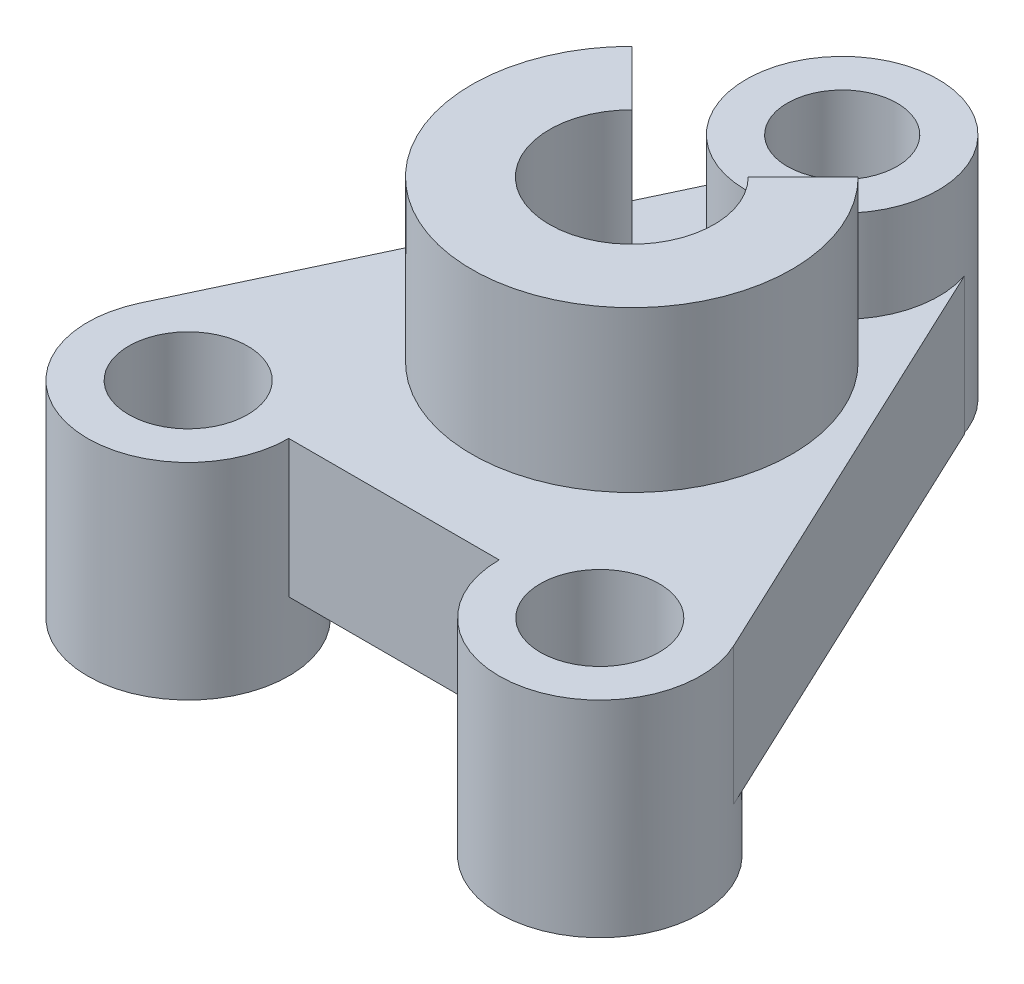
ISO-10303-21;
HEADER;
FILE_DESCRIPTION(('STEP AP214'),'2;1');
FILE_NAME('part.step','',(''),(''),'','','');
FILE_SCHEMA(('AUTOMOTIVE_DESIGN { 1 0 10303 214 1 1 1 1 }'));
ENDSEC;
DATA;
#1=APPLICATION_CONTEXT('core data for automotive mechanical design processes');
#2=APPLICATION_PROTOCOL_DEFINITION('international standard','automotive_design',2000,#1);
#3=PRODUCT_CONTEXT('',#1,'mechanical');
#4=PRODUCT('Part','Part','',(#3));
#5=PRODUCT_RELATED_PRODUCT_CATEGORY('part','',(#4));
#6=PRODUCT_DEFINITION_FORMATION('','',#4);
#7=PRODUCT_DEFINITION_CONTEXT('part definition',#1,'design');
#8=PRODUCT_DEFINITION('design','',#6,#7);
#9=PRODUCT_DEFINITION_SHAPE('','',#8);
#10=(LENGTH_UNIT() NAMED_UNIT(*) SI_UNIT(.MILLI.,.METRE.));
#11=(NAMED_UNIT(*) PLANE_ANGLE_UNIT() SI_UNIT($,.RADIAN.));
#12=(NAMED_UNIT(*) SI_UNIT($,.STERADIAN.) SOLID_ANGLE_UNIT());
#13=UNCERTAINTY_MEASURE_WITH_UNIT(LENGTH_MEASURE(1.E-05),#10,'distance_accuracy_value','');
#14=(GEOMETRIC_REPRESENTATION_CONTEXT(3) GLOBAL_UNCERTAINTY_ASSIGNED_CONTEXT((#13)) GLOBAL_UNIT_ASSIGNED_CONTEXT((#10,
#11,#12)) REPRESENTATION_CONTEXT('',''));
#15=CARTESIAN_POINT('',(0.,0.,0.));
#16=DIRECTION('',(0.,0.,1.));
#17=DIRECTION('',(1.,0.,0.));
#18=AXIS2_PLACEMENT_3D('',#15,#16,#17);
#19=CARTESIAN_POINT('',(-45.,-15.,19.0289138002507));
#20=DIRECTION('',(0.,1.,0.));
#21=DIRECTION('',(0.,0.,1.));
#22=AXIS2_PLACEMENT_3D('',#19,#20,#21);
#23=CYLINDRICAL_SURFACE('',#22,13.);
#24=CARTESIAN_POINT('',(-45.,-15.,19.0289138002507));
#25=DIRECTION('',(0.,1.,0.));
#26=DIRECTION('',(0.,0.,1.));
#27=AXIS2_PLACEMENT_3D('',#24,#25,#26);
#28=CIRCLE('',#27,13.);
#29=CARTESIAN_POINT('',(-45.,-15.,32.0289138002507));
#30=VERTEX_POINT('',#29);
#31=EDGE_CURVE('E57',#30,#30,#28,.T.);
#32=CARTESIAN_POINT('',(-45.,30.,19.0289138002507));
#33=DIRECTION('',(0.,1.,0.));
#34=DIRECTION('',(0.,0.,1.));
#35=AXIS2_PLACEMENT_3D('',#32,#33,#34);
#36=CIRCLE('',#35,13.);
#37=CARTESIAN_POINT('',(-45.,30.,32.0289138002507));
#38=VERTEX_POINT('',#37);
#39=EDGE_CURVE('E206',#38,#38,#36,.T.);
#40=CARTESIAN_POINT('',(-45.,-15.,32.0289138002507));
#41=CARTESIAN_POINT('',(-45.,-14.53125,32.0289138002507));
#42=CARTESIAN_POINT('',(-45.,-14.0625,32.0289138002507));
#43=CARTESIAN_POINT('',(-45.,-13.125,32.0289138002507));
#44=CARTESIAN_POINT('',(-45.,-12.65625,32.0289138002507));
#45=CARTESIAN_POINT('',(-45.,-11.71875,32.0289138002507));
#46=CARTESIAN_POINT('',(-45.,-11.25,32.0289138002507));
#47=CARTESIAN_POINT('',(-45.,-10.3125,32.0289138002507));
#48=CARTESIAN_POINT('',(-45.,-9.84375,32.0289138002507));
#49=CARTESIAN_POINT('',(-45.,-8.90625,32.0289138002507));
#50=CARTESIAN_POINT('',(-45.,-8.4375,32.0289138002507));
#51=CARTESIAN_POINT('',(-45.,-7.5,32.0289138002507));
#52=CARTESIAN_POINT('',(-45.,-7.03125,32.0289138002507));
#53=CARTESIAN_POINT('',(-45.,-6.09375,32.0289138002507));
#54=CARTESIAN_POINT('',(-45.,-5.625,32.0289138002507));
#55=CARTESIAN_POINT('',(-45.,-4.6875,32.0289138002507));
#56=CARTESIAN_POINT('',(-45.,-4.21875,32.0289138002507));
#57=CARTESIAN_POINT('',(-45.,-3.28125,32.0289138002507));
#58=CARTESIAN_POINT('',(-45.,-2.8125,32.0289138002507));
#59=CARTESIAN_POINT('',(-45.,-1.875,32.0289138002507));
#60=CARTESIAN_POINT('',(-45.,-1.40625,32.0289138002507));
#61=CARTESIAN_POINT('',(-45.,-0.468750000000002,32.0289138002507));
#62=CARTESIAN_POINT('',(-45.,0.,32.0289138002507));
#63=CARTESIAN_POINT('',(-45.,0.937499999999998,32.0289138002507));
#64=CARTESIAN_POINT('',(-45.,1.40625,32.0289138002507));
#65=CARTESIAN_POINT('',(-45.,2.34375,32.0289138002507));
#66=CARTESIAN_POINT('',(-45.,2.8125,32.0289138002507));
#67=CARTESIAN_POINT('',(-45.,3.75,32.0289138002507));
#68=CARTESIAN_POINT('',(-45.,4.21875,32.0289138002507));
#69=CARTESIAN_POINT('',(-45.,5.15625,32.0289138002507));
#70=CARTESIAN_POINT('',(-45.,5.625,32.0289138002507));
#71=CARTESIAN_POINT('',(-45.,6.5625,32.0289138002507));
#72=CARTESIAN_POINT('',(-45.,7.03125,32.0289138002507));
#73=CARTESIAN_POINT('',(-45.,7.96875,32.0289138002507));
#74=CARTESIAN_POINT('',(-45.,8.4375,32.0289138002507));
#75=CARTESIAN_POINT('',(-45.,9.375,32.0289138002507));
#76=CARTESIAN_POINT('',(-45.,9.84375,32.0289138002507));
#77=CARTESIAN_POINT('',(-45.,10.78125,32.0289138002507));
#78=CARTESIAN_POINT('',(-45.,11.25,32.0289138002507));
#79=CARTESIAN_POINT('',(-45.,12.1875,32.0289138002507));
#80=CARTESIAN_POINT('',(-45.,12.65625,32.0289138002507));
#81=CARTESIAN_POINT('',(-45.,13.59375,32.0289138002507));
#82=CARTESIAN_POINT('',(-45.,14.0625,32.0289138002507));
#83=CARTESIAN_POINT('',(-45.,15.,32.0289138002507));
#84=CARTESIAN_POINT('',(-45.,15.46875,32.0289138002507));
#85=CARTESIAN_POINT('',(-45.,16.40625,32.0289138002507));
#86=CARTESIAN_POINT('',(-45.,16.875,32.0289138002507));
#87=CARTESIAN_POINT('',(-45.,17.8125,32.0289138002507));
#88=CARTESIAN_POINT('',(-45.,18.28125,32.0289138002507));
#89=CARTESIAN_POINT('',(-45.,19.21875,32.0289138002507));
#90=CARTESIAN_POINT('',(-45.,19.6875,32.0289138002507));
#91=CARTESIAN_POINT('',(-45.,20.625,32.0289138002507));
#92=CARTESIAN_POINT('',(-45.,21.09375,32.0289138002507));
#93=CARTESIAN_POINT('',(-45.,22.03125,32.0289138002507));
#94=CARTESIAN_POINT('',(-45.,22.5,32.0289138002507));
#95=CARTESIAN_POINT('',(-45.,23.4375,32.0289138002507));
#96=CARTESIAN_POINT('',(-45.,23.90625,32.0289138002507));
#97=CARTESIAN_POINT('',(-45.,24.84375,32.0289138002507));
#98=CARTESIAN_POINT('',(-45.,25.3125,32.0289138002507));
#99=CARTESIAN_POINT('',(-45.,26.25,32.0289138002507));
#100=CARTESIAN_POINT('',(-45.,26.71875,32.0289138002507));
#101=CARTESIAN_POINT('',(-45.,27.65625,32.0289138002507));
#102=CARTESIAN_POINT('',(-45.,28.125,32.0289138002507));
#103=CARTESIAN_POINT('',(-45.,29.0625,32.0289138002507));
#104=CARTESIAN_POINT('',(-45.,29.53125,32.0289138002507));
#105=CARTESIAN_POINT('',(-45.,30.,32.0289138002507));
#106=B_SPLINE_CURVE_WITH_KNOTS('',3,(#40,#41,#42,#43,#44,#45,#46,#47,#48,#49,#50,#51,#52,#53,
#54,#55,#56,#57,#58,#59,#60,#61,#62,#63,#64,#65,#66,#67,#68,#69,#70,#71,#72,#73,#74,#75,#76,#77,
#78,#79,#80,#81,#82,#83,#84,#85,#86,#87,#88,#89,#90,#91,#92,#93,#94,#95,#96,#97,#98,#99,#100,
#101,#102,#103,#104,#105),.UNSPECIFIED.,.F.,.F.,(4,2,2,2,2,2,2,2,2,2,2,2,2,2,2,2,2,2,2,2,2,2,2,
2,2,2,2,2,2,2,2,2,4),(0.,1.40625,2.8125,4.21875,5.625,7.03125,8.4375,9.84375,11.25,12.65625,
14.0625,15.46875,16.875,18.28125,19.6875,21.09375,22.5,23.90625,25.3125,26.71875,28.125,
29.53125,30.9375,32.34375,33.75,35.15625,36.5625,37.96875,39.375,40.78125,42.1875,43.59375,45.),.UNSPECIFIED.);
#107=EDGE_CURVE('BSEAM49',#30,#38,#106,.T.);
#108=ORIENTED_EDGE('',*,*,#31,.F.);
#109=ORIENTED_EDGE('',*,*,#39,.T.);
#110=ORIENTED_EDGE('',*,*,#107,.T.);
#111=ORIENTED_EDGE('',*,*,#107,.F.);
#112=EDGE_LOOP('',(#108,#110,#109,#111));
#113=FACE_BOUND('',#112,.T.);
#114=ADVANCED_FACE('F49',(#113),#23,.F.);
#115=CARTESIAN_POINT('',(-45.,-15.,19.0289138002507));
#116=DIRECTION('',(0.,1.,0.));
#117=DIRECTION('',(0.,0.,1.));
#118=AXIS2_PLACEMENT_3D('',#115,#116,#117);
#119=CYLINDRICAL_SURFACE('',#118,22.);
#120=DIRECTION('',(0.,1.,0.));
#121=VECTOR('',#120,1.);
#122=CARTESIAN_POINT('',(-23.,0.,19.0289138002507));
#123=LINE('',#122,#121);
#124=CARTESIAN_POINT('',(-23.,0.,19.0289138002507));
#125=VERTEX_POINT('',#124);
#126=CARTESIAN_POINT('',(-23.,30.,19.0289138002507));
#127=VERTEX_POINT('',#126);
#128=EDGE_CURVE('E212',#125,#127,#123,.T.);
#129=ORIENTED_EDGE('',*,*,#128,.T.);
#130=CARTESIAN_POINT('',(-45.,30.,19.0289138002507));
#131=DIRECTION('',(0.,1.,0.));
#132=DIRECTION('',(0.,0.,1.));
#133=AXIS2_PLACEMENT_3D('',#130,#131,#132);
#134=CIRCLE('',#133,22.);
#135=CARTESIAN_POINT('',(-64.9069901947364,30.,9.66345911899421));
#136=VERTEX_POINT('',#135);
#137=EDGE_CURVE('E52',#136,#127,#134,.T.);
#138=ORIENTED_EDGE('',*,*,#137,.F.);
#139=DIRECTION('',(0.,1.,0.));
#140=VECTOR('',#139,1.);
#141=CARTESIAN_POINT('',(-64.9069901947364,0.,9.66345911899421));
#142=LINE('',#141,#140);
#143=CARTESIAN_POINT('',(-64.9069901947364,0.,9.66345911899421));
#144=VERTEX_POINT('',#143);
#145=EDGE_CURVE('E215',#144,#136,#142,.T.);
#146=ORIENTED_EDGE('',*,*,#145,.F.);
#147=CARTESIAN_POINT('',(-45.,0.,19.0289138002507));
#148=DIRECTION('',(0.,-1.,0.));
#149=DIRECTION('',(0.,0.,1.));
#150=AXIS2_PLACEMENT_3D('',#147,#148,#149);
#151=CIRCLE('',#150,22.);
#152=EDGE_CURVE('E182',#144,#125,#151,.T.);
#153=ORIENTED_EDGE('',*,*,#152,.T.);
#154=EDGE_LOOP('',(#129,#138,#146,#153));
#155=FACE_BOUND('',#154,.T.);
#156=CARTESIAN_POINT('',(-45.,-15.,19.0289138002507));
#157=DIRECTION('',(0.,1.,0.));
#158=DIRECTION('',(0.,0.,1.));
#159=AXIS2_PLACEMENT_3D('',#156,#157,#158);
#160=CIRCLE('',#159,22.);
#161=CARTESIAN_POINT('',(-45.,-15.,41.0289138002507));
#162=VERTEX_POINT('',#161);
#163=EDGE_CURVE('E12',#162,#162,#160,.T.);
#164=ORIENTED_EDGE('',*,*,#163,.T.);
#165=EDGE_LOOP('',(#164));
#166=FACE_BOUND('',#165,.T.);
#167=ADVANCED_FACE('F231',(#155,#166),#119,.T.);
#168=CARTESIAN_POINT('',(0.,-15.,0.));
#169=DIRECTION('',(0.,1.,0.));
#170=DIRECTION('',(0.,0.,1.));
#171=AXIS2_PLACEMENT_3D('',#168,#169,#170);
#172=PLANE('',#171);
#173=ORIENTED_EDGE('',*,*,#31,.T.);
#174=EDGE_LOOP('',(#173));
#175=FACE_BOUND('',#174,.T.);
#176=ORIENTED_EDGE('',*,*,#163,.F.);
#177=EDGE_LOOP('',(#176));
#178=FACE_BOUND('',#177,.T.);
#179=ADVANCED_FACE('F267',(#175,#178),#172,.F.);
#180=CARTESIAN_POINT('',(0.,30.,0.));
#181=DIRECTION('',(0.,1.,0.));
#182=DIRECTION('',(0.,0.,1.));
#183=AXIS2_PLACEMENT_3D('',#180,#181,#182);
#184=PLANE('',#183);
#185=CARTESIAN_POINT('',(0.,30.,-32.9710861997493));
#186=DIRECTION('',(0.,-1.,0.));
#187=DIRECTION('',(0.,0.,1.));
#188=AXIS2_PLACEMENT_3D('',#185,#186,#187);
#189=CIRCLE('',#188,18.);
#190=CARTESIAN_POINT('',(12.7279220613579,30.,-45.6990082611071));
#191=VERTEX_POINT('',#190);
#192=CARTESIAN_POINT('',(-12.7279220613579,30.,-45.6990082611071));
#193=VERTEX_POINT('',#192);
#194=EDGE_CURVE('E65',#191,#193,#189,.T.);
#195=ORIENTED_EDGE('',*,*,#194,.F.);
#196=DIRECTION('',(-0.707106781186547,0.,0.707106781186548));
#197=VECTOR('',#196,1.);
#198=CARTESIAN_POINT('',(12.7279220613579,30.,-45.6990082611071));
#199=LINE('',#198,#197);
#200=CARTESIAN_POINT('',(24.7487373415292,30.,-57.7198235412784));
#201=VERTEX_POINT('',#200);
#202=EDGE_CURVE('E70',#201,#191,#199,.T.);
#203=ORIENTED_EDGE('',*,*,#202,.F.);
#204=CARTESIAN_POINT('',(0.,30.,-32.9710861997493));
#205=DIRECTION('',(0.,1.,0.));
#206=DIRECTION('',(0.,0.,1.));
#207=AXIS2_PLACEMENT_3D('',#204,#205,#206);
#208=CIRCLE('',#207,35.);
#209=CARTESIAN_POINT('',(-24.7487373415293,30.,-57.7198235412784));
#210=VERTEX_POINT('',#209);
#211=EDGE_CURVE('E124',#210,#201,#208,.T.);
#212=ORIENTED_EDGE('',*,*,#211,.F.);
#213=DIRECTION('',(-0.707106781186551,0.,-0.707106781186544));
#214=VECTOR('',#213,1.);
#215=CARTESIAN_POINT('',(-12.7279220613579,30.,-45.6990082611071));
#216=LINE('',#215,#214);
#217=EDGE_CURVE('E129',#193,#210,#216,.T.);
#218=ORIENTED_EDGE('',*,*,#217,.F.);
#219=EDGE_LOOP('',(#195,#203,#212,#218));
#220=FACE_BOUND('',#219,.T.);
#221=ORIENTED_EDGE('',*,*,#39,.F.);
#222=EDGE_LOOP('',(#221));
#223=FACE_BOUND('',#222,.T.);
#224=ORIENTED_EDGE('',*,*,#137,.T.);
#225=DIRECTION('',(1.,0.,0.));
#226=VECTOR('',#225,1.);
#227=CARTESIAN_POINT('',(-23.,30.,19.0289138002507));
#228=LINE('',#227,#226);
#229=CARTESIAN_POINT('',(23.,30.,19.0289138002507));
#230=VERTEX_POINT('',#229);
#231=EDGE_CURVE('E199',#127,#230,#228,.T.);
#232=ORIENTED_EDGE('',*,*,#231,.T.);
#233=CARTESIAN_POINT('',(45.,30.,19.0289138002507));
#234=DIRECTION('',(0.,1.,0.));
#235=DIRECTION('',(0.,0.,1.));
#236=AXIS2_PLACEMENT_3D('',#233,#234,#235);
#237=CIRCLE('',#236,22.);
#238=CARTESIAN_POINT('',(64.9069901947364,30.,9.6634591189942));
#239=VERTEX_POINT('',#238);
#240=EDGE_CURVE('E167',#230,#239,#237,.T.);
#241=ORIENTED_EDGE('',*,*,#240,.T.);
#242=DIRECTION('',(-0.425702485511659,0.,-0.904863190669836));
#243=VECTOR('',#242,1.);
#244=CARTESIAN_POINT('',(64.9069901947364,30.,9.66345911899421));
#245=LINE('',#244,#243);
#246=CARTESIAN_POINT('',(20.0894652472151,30.,-85.5996178000819));
#247=VERTEX_POINT('',#246);
#248=EDGE_CURVE('E179',#239,#247,#245,.T.);
#249=ORIENTED_EDGE('',*,*,#248,.T.);
#250=CARTESIAN_POINT('',(0.,30.,-78.9710861997493));
#251=DIRECTION('',(0.,-1.,0.));
#252=DIRECTION('',(0.,0.,1.));
#253=AXIS2_PLACEMENT_3D('',#250,#251,#252);
#254=CIRCLE('',#253,21.1547641229031);
#255=CARTESIAN_POINT('',(-20.0894652472151,30.,-85.5996178000819));
#256=VERTEX_POINT('',#255);
#257=EDGE_CURVE('E170',#247,#256,#254,.T.);
#258=ORIENTED_EDGE('',*,*,#257,.T.);
#259=DIRECTION('',(-0.425702485511659,0.,0.904863190669836));
#260=VECTOR('',#259,1.);
#261=CARTESIAN_POINT('',(-64.9069901947364,30.,9.66345911899421));
#262=LINE('',#261,#260);
#263=EDGE_CURVE('E197',#256,#136,#262,.T.);
#264=ORIENTED_EDGE('',*,*,#263,.T.);
#265=EDGE_LOOP('',(#224,#232,#241,#249,#258,#264));
#266=FACE_BOUND('',#265,.T.);
#267=CARTESIAN_POINT('',(45.,30.,19.0289138002507));
#268=DIRECTION('',(0.,1.,0.));
#269=DIRECTION('',(0.,0.,1.));
#270=AXIS2_PLACEMENT_3D('',#267,#268,#269);
#271=CIRCLE('',#270,13.);
#272=CARTESIAN_POINT('',(45.,30.,32.0289138002507));
#273=VERTEX_POINT('',#272);
#274=EDGE_CURVE('E160',#273,#273,#271,.T.);
#275=ORIENTED_EDGE('',*,*,#274,.F.);
#276=EDGE_LOOP('',(#275));
#277=FACE_BOUND('',#276,.T.);
#278=ADVANCED_FACE('F126',(#220,#223,#266,#277),#184,.T.);
#279=CARTESIAN_POINT('',(0.,0.,-78.9710861997493));
#280=DIRECTION('',(0.,1.,0.));
#281=DIRECTION('',(0.,0.,1.));
#282=AXIS2_PLACEMENT_3D('',#279,#280,#281);
#283=CYLINDRICAL_SURFACE('',#282,21.1547641229031);
#284=ORIENTED_EDGE('',*,*,#257,.F.);
#285=DIRECTION('',(0.,1.,0.));
#286=VECTOR('',#285,1.);
#287=CARTESIAN_POINT('',(20.0894652472151,0.,-85.5996178000819));
#288=LINE('',#287,#286);
#289=CARTESIAN_POINT('',(20.0894652472151,0.,-85.5996178000819));
#290=VERTEX_POINT('',#289);
#291=EDGE_CURVE('E204',#290,#247,#288,.T.);
#292=ORIENTED_EDGE('',*,*,#291,.F.);
#293=CARTESIAN_POINT('',(0.,0.,-78.9710861997493));
#294=DIRECTION('',(0.,-1.,0.));
#295=DIRECTION('',(0.,0.,1.));
#296=AXIS2_PLACEMENT_3D('',#293,#294,#295);
#297=CIRCLE('',#296,21.1547641229031);
#298=CARTESIAN_POINT('',(-20.0894652472151,0.,-85.5996178000819));
#299=VERTEX_POINT('',#298);
#300=EDGE_CURVE('E175',#290,#299,#297,.T.);
#301=ORIENTED_EDGE('',*,*,#300,.T.);
#302=DIRECTION('',(0.,1.,0.));
#303=VECTOR('',#302,1.);
#304=CARTESIAN_POINT('',(-20.0894652472151,0.,-85.5996178000819));
#305=LINE('',#304,#303);
#306=EDGE_CURVE('E194',#299,#256,#305,.T.);
#307=ORIENTED_EDGE('',*,*,#306,.T.);
#308=EDGE_LOOP('',(#284,#292,#301,#307));
#309=FACE_BOUND('',#308,.T.);
#310=ADVANCED_FACE('F248',(#309),#283,.F.);
#311=CARTESIAN_POINT('',(64.9069901947364,0.,9.66345911899421));
#312=DIRECTION('',(0.904863190669836,0.,-0.425702485511659));
#313=DIRECTION('',(-0.425702485511659,0.,-0.904863190669836));
#314=AXIS2_PLACEMENT_3D('',#311,#312,#313);
#315=PLANE('',#314);
#316=ORIENTED_EDGE('',*,*,#248,.F.);
#317=DIRECTION('',(0.,1.,0.));
#318=VECTOR('',#317,1.);
#319=CARTESIAN_POINT('',(64.9069901947364,0.,9.6634591189942));
#320=LINE('',#319,#318);
#321=CARTESIAN_POINT('',(64.9069901947364,0.,9.66345911899421));
#322=VERTEX_POINT('',#321);
#323=EDGE_CURVE('E207',#322,#239,#320,.T.);
#324=ORIENTED_EDGE('',*,*,#323,.F.);
#325=DIRECTION('',(-0.425702485511659,0.,-0.904863190669836));
#326=VECTOR('',#325,1.);
#327=CARTESIAN_POINT('',(64.9069901947364,0.,9.66345911899421));
#328=LINE('',#327,#326);
#329=EDGE_CURVE('E191',#322,#290,#328,.T.);
#330=ORIENTED_EDGE('',*,*,#329,.T.);
#331=ORIENTED_EDGE('',*,*,#291,.T.);
#332=EDGE_LOOP('',(#316,#324,#330,#331));
#333=FACE_BOUND('',#332,.T.);
#334=ADVANCED_FACE('F246',(#333),#315,.T.);
#335=CARTESIAN_POINT('',(-23.,0.,19.0289138002507));
#336=DIRECTION('',(0.,0.,1.));
#337=DIRECTION('',(1.,0.,0.));
#338=AXIS2_PLACEMENT_3D('',#335,#336,#337);
#339=PLANE('',#338);
#340=ORIENTED_EDGE('',*,*,#231,.F.);
#341=ORIENTED_EDGE('',*,*,#128,.F.);
#342=DIRECTION('',(1.,0.,0.));
#343=VECTOR('',#342,1.);
#344=CARTESIAN_POINT('',(-23.,0.,19.0289138002507));
#345=LINE('',#344,#343);
#346=CARTESIAN_POINT('',(23.,0.,19.0289138002507));
#347=VERTEX_POINT('',#346);
#348=EDGE_CURVE('E185',#125,#347,#345,.T.);
#349=ORIENTED_EDGE('',*,*,#348,.T.);
#350=DIRECTION('',(0.,1.,0.));
#351=VECTOR('',#350,1.);
#352=CARTESIAN_POINT('',(23.,0.,19.0289138002507));
#353=LINE('',#352,#351);
#354=EDGE_CURVE('E210',#347,#230,#353,.T.);
#355=ORIENTED_EDGE('',*,*,#354,.T.);
#356=EDGE_LOOP('',(#340,#341,#349,#355));
#357=FACE_BOUND('',#356,.T.);
#358=ADVANCED_FACE('F235',(#357),#339,.T.);
#359=CARTESIAN_POINT('',(-64.9069901947364,0.,9.66345911899421));
#360=DIRECTION('',(-0.904863190669836,0.,-0.425702485511659));
#361=DIRECTION('',(-0.425702485511659,0.,0.904863190669836));
#362=AXIS2_PLACEMENT_3D('',#359,#360,#361);
#363=PLANE('',#362);
#364=ORIENTED_EDGE('',*,*,#263,.F.);
#365=ORIENTED_EDGE('',*,*,#306,.F.);
#366=DIRECTION('',(-0.425702485511659,0.,0.904863190669836));
#367=VECTOR('',#366,1.);
#368=CARTESIAN_POINT('',(-64.9069901947364,0.,9.66345911899421));
#369=LINE('',#368,#367);
#370=EDGE_CURVE('E178',#299,#144,#369,.T.);
#371=ORIENTED_EDGE('',*,*,#370,.T.);
#372=ORIENTED_EDGE('',*,*,#145,.T.);
#373=EDGE_LOOP('',(#364,#365,#371,#372));
#374=FACE_BOUND('',#373,.T.);
#375=ADVANCED_FACE('F250',(#374),#363,.T.);
#376=CARTESIAN_POINT('',(0.,0.,-78.9710861997493));
#377=DIRECTION('',(0.,1.,0.));
#378=DIRECTION('',(0.,0.,1.));
#379=AXIS2_PLACEMENT_3D('',#376,#377,#378);
#380=PLANE('',#379);
#381=ORIENTED_EDGE('',*,*,#300,.F.);
#382=ORIENTED_EDGE('',*,*,#329,.F.);
#383=CARTESIAN_POINT('',(45.,0.,19.0289138002507));
#384=DIRECTION('',(0.,-1.,0.));
#385=DIRECTION('',(0.,0.,1.));
#386=AXIS2_PLACEMENT_3D('',#383,#384,#385);
#387=CIRCLE('',#386,22.);
#388=EDGE_CURVE('E188',#347,#322,#387,.T.);
#389=ORIENTED_EDGE('',*,*,#388,.F.);
#390=ORIENTED_EDGE('',*,*,#348,.F.);
#391=ORIENTED_EDGE('',*,*,#152,.F.);
#392=ORIENTED_EDGE('',*,*,#370,.F.);
#393=EDGE_LOOP('',(#381,#382,#389,#390,#391,#392));
#394=FACE_BOUND('',#393,.T.);
#395=ADVANCED_FACE('F239',(#394),#380,.F.);
#396=CARTESIAN_POINT('',(45.,-15.,19.0289138002507));
#397=DIRECTION('',(0.,1.,0.));
#398=DIRECTION('',(0.,0.,1.));
#399=AXIS2_PLACEMENT_3D('',#396,#397,#398);
#400=CYLINDRICAL_SURFACE('',#399,13.);
#401=CARTESIAN_POINT('',(45.,-15.,19.0289138002507));
#402=DIRECTION('',(0.,1.,0.));
#403=DIRECTION('',(0.,0.,1.));
#404=AXIS2_PLACEMENT_3D('',#401,#402,#403);
#405=CIRCLE('',#404,13.);
#406=CARTESIAN_POINT('',(45.,-15.,32.0289138002507));
#407=VERTEX_POINT('',#406);
#408=EDGE_CURVE('E163',#407,#407,#405,.T.);
#409=CARTESIAN_POINT('',(45.,-15.,32.0289138002507));
#410=CARTESIAN_POINT('',(45.,-14.53125,32.0289138002507));
#411=CARTESIAN_POINT('',(45.,-14.0625,32.0289138002507));
#412=CARTESIAN_POINT('',(45.,-13.125,32.0289138002507));
#413=CARTESIAN_POINT('',(45.,-12.65625,32.0289138002507));
#414=CARTESIAN_POINT('',(45.,-11.71875,32.0289138002507));
#415=CARTESIAN_POINT('',(45.,-11.25,32.0289138002507));
#416=CARTESIAN_POINT('',(45.,-10.3125,32.0289138002507));
#417=CARTESIAN_POINT('',(45.,-9.84375,32.0289138002507));
#418=CARTESIAN_POINT('',(45.,-8.90625,32.0289138002507));
#419=CARTESIAN_POINT('',(45.,-8.4375,32.0289138002507));
#420=CARTESIAN_POINT('',(45.,-7.5,32.0289138002507));
#421=CARTESIAN_POINT('',(45.,-7.03125,32.0289138002507));
#422=CARTESIAN_POINT('',(45.,-6.09375,32.0289138002507));
#423=CARTESIAN_POINT('',(45.,-5.625,32.0289138002507));
#424=CARTESIAN_POINT('',(45.,-4.6875,32.0289138002507));
#425=CARTESIAN_POINT('',(45.,-4.21875,32.0289138002507));
#426=CARTESIAN_POINT('',(45.,-3.28125,32.0289138002507));
#427=CARTESIAN_POINT('',(45.,-2.8125,32.0289138002507));
#428=CARTESIAN_POINT('',(45.,-1.875,32.0289138002507));
#429=CARTESIAN_POINT('',(45.,-1.40625,32.0289138002507));
#430=CARTESIAN_POINT('',(45.,-0.468750000000002,32.0289138002507));
#431=CARTESIAN_POINT('',(45.,0.,32.0289138002507));
#432=CARTESIAN_POINT('',(45.,0.937499999999998,32.0289138002507));
#433=CARTESIAN_POINT('',(45.,1.40625,32.0289138002507));
#434=CARTESIAN_POINT('',(45.,2.34375,32.0289138002507));
#435=CARTESIAN_POINT('',(45.,2.8125,32.0289138002507));
#436=CARTESIAN_POINT('',(45.,3.75,32.0289138002507));
#437=CARTESIAN_POINT('',(45.,4.21875,32.0289138002507));
#438=CARTESIAN_POINT('',(45.,5.15625,32.0289138002507));
#439=CARTESIAN_POINT('',(45.,5.625,32.0289138002507));
#440=CARTESIAN_POINT('',(45.,6.5625,32.0289138002507));
#441=CARTESIAN_POINT('',(45.,7.03125,32.0289138002507));
#442=CARTESIAN_POINT('',(45.,7.96875,32.0289138002507));
#443=CARTESIAN_POINT('',(45.,8.4375,32.0289138002507));
#444=CARTESIAN_POINT('',(45.,9.375,32.0289138002507));
#445=CARTESIAN_POINT('',(45.,9.84375,32.0289138002507));
#446=CARTESIAN_POINT('',(45.,10.78125,32.0289138002507));
#447=CARTESIAN_POINT('',(45.,11.25,32.0289138002507));
#448=CARTESIAN_POINT('',(45.,12.1875,32.0289138002507));
#449=CARTESIAN_POINT('',(45.,12.65625,32.0289138002507));
#450=CARTESIAN_POINT('',(45.,13.59375,32.0289138002507));
#451=CARTESIAN_POINT('',(45.,14.0625,32.0289138002507));
#452=CARTESIAN_POINT('',(45.,15.,32.0289138002507));
#453=CARTESIAN_POINT('',(45.,15.46875,32.0289138002507));
#454=CARTESIAN_POINT('',(45.,16.40625,32.0289138002507));
#455=CARTESIAN_POINT('',(45.,16.875,32.0289138002507));
#456=CARTESIAN_POINT('',(45.,17.8125,32.0289138002507));
#457=CARTESIAN_POINT('',(45.,18.28125,32.0289138002507));
#458=CARTESIAN_POINT('',(45.,19.21875,32.0289138002507));
#459=CARTESIAN_POINT('',(45.,19.6875,32.0289138002507));
#460=CARTESIAN_POINT('',(45.,20.625,32.0289138002507));
#461=CARTESIAN_POINT('',(45.,21.09375,32.0289138002507));
#462=CARTESIAN_POINT('',(45.,22.03125,32.0289138002507));
#463=CARTESIAN_POINT('',(45.,22.5,32.0289138002507));
#464=CARTESIAN_POINT('',(45.,23.4375,32.0289138002507));
#465=CARTESIAN_POINT('',(45.,23.90625,32.0289138002507));
#466=CARTESIAN_POINT('',(45.,24.84375,32.0289138002507));
#467=CARTESIAN_POINT('',(45.,25.3125,32.0289138002507));
#468=CARTESIAN_POINT('',(45.,26.25,32.0289138002507));
#469=CARTESIAN_POINT('',(45.,26.71875,32.0289138002507));
#470=CARTESIAN_POINT('',(45.,27.65625,32.0289138002507));
#471=CARTESIAN_POINT('',(45.,28.125,32.0289138002507));
#472=CARTESIAN_POINT('',(45.,29.0625,32.0289138002507));
#473=CARTESIAN_POINT('',(45.,29.53125,32.0289138002507));
#474=CARTESIAN_POINT('',(45.,30.,32.0289138002507));
#475=B_SPLINE_CURVE_WITH_KNOTS('',3,(#409,#410,#411,#412,#413,#414,#415,#416,#417,#418,#419,
#420,#421,#422,#423,#424,#425,#426,#427,#428,#429,#430,#431,#432,#433,#434,#435,#436,#437,#438,
#439,#440,#441,#442,#443,#444,#445,#446,#447,#448,#449,#450,#451,#452,#453,#454,#455,#456,#457,
#458,#459,#460,#461,#462,#463,#464,#465,#466,#467,#468,#469,#470,#471,#472,#473,#474),
.UNSPECIFIED.,.F.,.F.,(4,2,2,2,2,2,2,2,2,2,2,2,2,2,2,2,2,2,2,2,2,2,2,2,2,2,2,2,2,2,2,2,4),(0.,
1.40625,2.8125,4.21875,5.625,7.03125,8.4375,9.84375,11.25,12.65625,14.0625,15.46875,16.875,
18.28125,19.6875,21.09375,22.5,23.90625,25.3125,26.71875,28.125,29.53125,30.9375,32.34375,33.75,
35.15625,36.5625,37.96875,39.375,40.78125,42.1875,43.59375,45.),.UNSPECIFIED.);
#476=EDGE_CURVE('BSEAM257',#407,#273,#475,.T.);
#477=ORIENTED_EDGE('',*,*,#408,.F.);
#478=ORIENTED_EDGE('',*,*,#274,.T.);
#479=ORIENTED_EDGE('',*,*,#476,.T.);
#480=ORIENTED_EDGE('',*,*,#476,.F.);
#481=EDGE_LOOP('',(#477,#479,#478,#480));
#482=FACE_BOUND('',#481,.T.);
#483=ADVANCED_FACE('F257',(#482),#400,.F.);
#484=CARTESIAN_POINT('',(45.,-15.,19.0289138002507));
#485=DIRECTION('',(0.,1.,0.));
#486=DIRECTION('',(0.,0.,1.));
#487=AXIS2_PLACEMENT_3D('',#484,#485,#486);
#488=CYLINDRICAL_SURFACE('',#487,22.);
#489=CARTESIAN_POINT('',(45.,-15.,19.0289138002507));
#490=DIRECTION('',(0.,1.,0.));
#491=DIRECTION('',(0.,0.,1.));
#492=AXIS2_PLACEMENT_3D('',#489,#490,#491);
#493=CIRCLE('',#492,22.);
#494=CARTESIAN_POINT('',(45.,-15.,41.0289138002507));
#495=VERTEX_POINT('',#494);
#496=EDGE_CURVE('E166',#495,#495,#493,.T.);
#497=ORIENTED_EDGE('',*,*,#496,.T.);
#498=EDGE_LOOP('',(#497));
#499=FACE_BOUND('',#498,.T.);
#500=ORIENTED_EDGE('',*,*,#388,.T.);
#501=ORIENTED_EDGE('',*,*,#323,.T.);
#502=ORIENTED_EDGE('',*,*,#240,.F.);
#503=ORIENTED_EDGE('',*,*,#354,.F.);
#504=EDGE_LOOP('',(#500,#501,#502,#503));
#505=FACE_BOUND('',#504,.T.);
#506=ADVANCED_FACE('F243',(#499,#505),#488,.T.);
#507=CARTESIAN_POINT('',(0.,-15.,0.));
#508=DIRECTION('',(0.,1.,0.));
#509=DIRECTION('',(0.,0.,1.));
#510=AXIS2_PLACEMENT_3D('',#507,#508,#509);
#511=PLANE('',#510);
#512=ORIENTED_EDGE('',*,*,#408,.T.);
#513=EDGE_LOOP('',(#512));
#514=FACE_BOUND('',#513,.T.);
#515=ORIENTED_EDGE('',*,*,#496,.F.);
#516=EDGE_LOOP('',(#515));
#517=FACE_BOUND('',#516,.T.);
#518=ADVANCED_FACE('F290',(#514,#517),#511,.F.);
#519=CARTESIAN_POINT('',(0.,30.,-32.9710861997493));
#520=DIRECTION('',(0.,1.,0.));
#521=DIRECTION('',(0.,0.,1.));
#522=AXIS2_PLACEMENT_3D('',#519,#520,#521);
#523=CYLINDRICAL_SURFACE('',#522,18.);
#524=CARTESIAN_POINT('',(0.,65.,-32.9710861997493));
#525=DIRECTION('',(0.,-1.,0.));
#526=DIRECTION('',(0.,0.,1.));
#527=AXIS2_PLACEMENT_3D('',#524,#525,#526);
#528=CIRCLE('',#527,18.);
#529=CARTESIAN_POINT('',(12.7279220613579,65.,-45.6990082611071));
#530=VERTEX_POINT('',#529);
#531=CARTESIAN_POINT('',(-12.7279220613579,65.,-45.6990082611071));
#532=VERTEX_POINT('',#531);
#533=EDGE_CURVE('E150',#530,#532,#528,.T.);
#534=ORIENTED_EDGE('',*,*,#533,.F.);
#535=DIRECTION('',(0.,1.,0.));
#536=VECTOR('',#535,1.);
#537=CARTESIAN_POINT('',(12.7279220613579,30.,-45.6990082611071));
#538=LINE('',#537,#536);
#539=EDGE_CURVE('E158',#191,#530,#538,.T.);
#540=ORIENTED_EDGE('',*,*,#539,.F.);
#541=ORIENTED_EDGE('',*,*,#194,.T.);
#542=DIRECTION('',(0.,1.,0.));
#543=VECTOR('',#542,1.);
#544=CARTESIAN_POINT('',(-12.7279220613579,30.,-45.6990082611071));
#545=LINE('',#544,#543);
#546=EDGE_CURVE('E142',#193,#532,#545,.T.);
#547=ORIENTED_EDGE('',*,*,#546,.T.);
#548=EDGE_LOOP('',(#534,#540,#541,#547));
#549=FACE_BOUND('',#548,.T.);
#550=ADVANCED_FACE('F294',(#549),#523,.F.);
#551=CARTESIAN_POINT('',(12.7279220613579,30.,-45.6990082611071));
#552=DIRECTION('',(-0.707106781186548,0.,-0.707106781186547));
#553=DIRECTION('',(-0.707106781186547,0.,0.707106781186548));
#554=AXIS2_PLACEMENT_3D('',#551,#552,#553);
#555=PLANE('',#554);
#556=DIRECTION('',(-0.707106781186547,0.,0.707106781186548));
#557=VECTOR('',#556,1.);
#558=CARTESIAN_POINT('',(12.7279220613579,65.,-45.6990082611071));
#559=LINE('',#558,#557);
#560=CARTESIAN_POINT('',(24.7487373415292,65.,-57.7198235412784));
#561=VERTEX_POINT('',#560);
#562=EDGE_CURVE('E146',#561,#530,#559,.T.);
#563=ORIENTED_EDGE('',*,*,#562,.F.);
#564=DIRECTION('',(0.,1.,0.));
#565=VECTOR('',#564,1.);
#566=CARTESIAN_POINT('',(24.7487373415292,30.,-57.7198235412784));
#567=LINE('',#566,#565);
#568=EDGE_CURVE('E141',#201,#561,#567,.T.);
#569=ORIENTED_EDGE('',*,*,#568,.F.);
#570=ORIENTED_EDGE('',*,*,#202,.T.);
#571=ORIENTED_EDGE('',*,*,#539,.T.);
#572=EDGE_LOOP('',(#563,#569,#570,#571));
#573=FACE_BOUND('',#572,.T.);
#574=ADVANCED_FACE('F298',(#573),#555,.T.);
#575=CARTESIAN_POINT('',(0.,30.,-32.9710861997493));
#576=DIRECTION('',(0.,1.,0.));
#577=DIRECTION('',(0.,0.,1.));
#578=AXIS2_PLACEMENT_3D('',#575,#576,#577);
#579=CYLINDRICAL_SURFACE('',#578,35.);
#580=CARTESIAN_POINT('',(0.,65.,-32.9710861997493));
#581=DIRECTION('',(0.,1.,0.));
#582=DIRECTION('',(0.,0.,1.));
#583=AXIS2_PLACEMENT_3D('',#580,#581,#582);
#584=CIRCLE('',#583,35.);
#585=CARTESIAN_POINT('',(-24.7487373415293,65.,-57.7198235412784));
#586=VERTEX_POINT('',#585);
#587=EDGE_CURVE('E137',#586,#561,#584,.T.);
#588=ORIENTED_EDGE('',*,*,#587,.F.);
#589=DIRECTION('',(0.,1.,0.));
#590=VECTOR('',#589,1.);
#591=CARTESIAN_POINT('',(-24.7487373415293,30.,-57.7198235412784));
#592=LINE('',#591,#590);
#593=EDGE_CURVE('E134',#210,#586,#592,.T.);
#594=ORIENTED_EDGE('',*,*,#593,.F.);
#595=ORIENTED_EDGE('',*,*,#211,.T.);
#596=ORIENTED_EDGE('',*,*,#568,.T.);
#597=EDGE_LOOP('',(#588,#594,#595,#596));
#598=FACE_BOUND('',#597,.T.);
#599=ADVANCED_FACE('F135',(#598),#579,.T.);
#600=CARTESIAN_POINT('',(-12.7279220613579,30.,-45.6990082611071));
#601=DIRECTION('',(0.707106781186544,0.,-0.707106781186551));
#602=DIRECTION('',(-0.707106781186551,0.,-0.707106781186544));
#603=AXIS2_PLACEMENT_3D('',#600,#601,#602);
#604=PLANE('',#603);
#605=DIRECTION('',(-0.707106781186551,0.,-0.707106781186544));
#606=VECTOR('',#605,1.);
#607=CARTESIAN_POINT('',(-12.7279220613579,65.,-45.6990082611071));
#608=LINE('',#607,#606);
#609=EDGE_CURVE('E153',#532,#586,#608,.T.);
#610=ORIENTED_EDGE('',*,*,#609,.F.);
#611=ORIENTED_EDGE('',*,*,#546,.F.);
#612=ORIENTED_EDGE('',*,*,#217,.T.);
#613=ORIENTED_EDGE('',*,*,#593,.T.);
#614=EDGE_LOOP('',(#610,#611,#612,#613));
#615=FACE_BOUND('',#614,.T.);
#616=ADVANCED_FACE('F144',(#615),#604,.T.);
#617=CARTESIAN_POINT('',(0.,65.,-32.9710861997493));
#618=DIRECTION('',(0.,1.,0.));
#619=DIRECTION('',(0.,0.,1.));
#620=AXIS2_PLACEMENT_3D('',#617,#618,#619);
#621=PLANE('',#620);
#622=ORIENTED_EDGE('',*,*,#533,.T.);
#623=ORIENTED_EDGE('',*,*,#609,.T.);
#624=ORIENTED_EDGE('',*,*,#587,.T.);
#625=ORIENTED_EDGE('',*,*,#562,.T.);
#626=EDGE_LOOP('',(#622,#623,#624,#625));
#627=FACE_BOUND('',#626,.T.);
#628=ADVANCED_FACE('F302',(#627),#621,.T.);
#629=CLOSED_SHELL('',(#114,#167,#179,#278,#310,#334,#358,#375,#395,#483,#506,#518,#550,#574,
#599,#616,#628));
#630=MANIFOLD_SOLID_BREP('B2',#629);
#631=CARTESIAN_POINT('',(0.,50.,-78.9710861997493));
#632=DIRECTION('',(0.,1.,0.));
#633=DIRECTION('',(0.,0.,1.));
#634=AXIS2_PLACEMENT_3D('',#631,#632,#633);
#635=PLANE('',#634);
#636=CARTESIAN_POINT('',(0.,50.,-78.9710861997493));
#637=DIRECTION('',(0.,1.,0.));
#638=DIRECTION('',(0.,0.,1.));
#639=AXIS2_PLACEMENT_3D('',#636,#637,#638);
#640=CIRCLE('',#639,21.);
#641=CARTESIAN_POINT('',(0.,50.,-57.9710861997493));
#642=VERTEX_POINT('',#641);
#643=EDGE_CURVE('E48',#642,#642,#640,.T.);
#644=ORIENTED_EDGE('',*,*,#643,.T.);
#645=EDGE_LOOP('',(#644));
#646=FACE_BOUND('',#645,.T.);
#647=CARTESIAN_POINT('',(0.,50.,-78.9710861997493));
#648=DIRECTION('',(0.,1.,0.));
#649=DIRECTION('',(0.,0.,1.));
#650=AXIS2_PLACEMENT_3D('',#647,#648,#649);
#651=CIRCLE('',#650,12.);
#652=CARTESIAN_POINT('',(0.,50.,-66.9710861997493));
#653=VERTEX_POINT('',#652);
#654=EDGE_CURVE('E453',#653,#653,#651,.T.);
#655=ORIENTED_EDGE('',*,*,#654,.F.);
#656=EDGE_LOOP('',(#655));
#657=FACE_BOUND('',#656,.T.);
#658=ADVANCED_FACE('F442',(#646,#657),#635,.T.);
#659=CARTESIAN_POINT('',(0.,0.,-78.9710861997493));
#660=DIRECTION('',(0.,1.,0.));
#661=DIRECTION('',(0.,0.,1.));
#662=AXIS2_PLACEMENT_3D('',#659,#660,#661);
#663=PLANE('',#662);
#664=CARTESIAN_POINT('',(0.,0.,-78.9710861997493));
#665=DIRECTION('',(0.,1.,0.));
#666=DIRECTION('',(0.,0.,1.));
#667=AXIS2_PLACEMENT_3D('',#664,#665,#666);
#668=CIRCLE('',#667,21.);
#669=CARTESIAN_POINT('',(0.,0.,-57.9710861997493));
#670=VERTEX_POINT('',#669);
#671=EDGE_CURVE('E446',#670,#670,#668,.T.);
#672=ORIENTED_EDGE('',*,*,#671,.F.);
#673=EDGE_LOOP('',(#672));
#674=FACE_BOUND('',#673,.T.);
#675=CARTESIAN_POINT('',(0.,0.,-78.9710861997493));
#676=DIRECTION('',(0.,1.,0.));
#677=DIRECTION('',(0.,0.,1.));
#678=AXIS2_PLACEMENT_3D('',#675,#676,#677);
#679=CIRCLE('',#678,12.);
#680=CARTESIAN_POINT('',(0.,0.,-66.9710861997493));
#681=VERTEX_POINT('',#680);
#682=EDGE_CURVE('E455',#681,#681,#679,.T.);
#683=ORIENTED_EDGE('',*,*,#682,.T.);
#684=EDGE_LOOP('',(#683));
#685=FACE_BOUND('',#684,.T.);
#686=ADVANCED_FACE('F465',(#674,#685),#663,.F.);
#687=CARTESIAN_POINT('',(0.,50.,-78.9710861997493));
#688=DIRECTION('',(0.,-1.,0.));
#689=DIRECTION('',(0.,0.,-1.));
#690=AXIS2_PLACEMENT_3D('',#687,#688,#689);
#691=CYLINDRICAL_SURFACE('',#690,21.);
#692=ORIENTED_EDGE('',*,*,#643,.F.);
#693=EDGE_LOOP('',(#692));
#694=FACE_BOUND('',#693,.T.);
#695=ORIENTED_EDGE('',*,*,#671,.T.);
#696=EDGE_LOOP('',(#695));
#697=FACE_BOUND('',#696,.T.);
#698=ADVANCED_FACE('F444',(#694,#697),#691,.T.);
#699=CARTESIAN_POINT('',(0.,50.,-78.9710861997493));
#700=DIRECTION('',(0.,-1.,0.));
#701=DIRECTION('',(0.,0.,-1.));
#702=AXIS2_PLACEMENT_3D('',#699,#700,#701);
#703=CYLINDRICAL_SURFACE('',#702,12.);
#704=ORIENTED_EDGE('',*,*,#654,.T.);
#705=EDGE_LOOP('',(#704));
#706=FACE_BOUND('',#705,.T.);
#707=ORIENTED_EDGE('',*,*,#682,.F.);
#708=EDGE_LOOP('',(#707));
#709=FACE_BOUND('',#708,.T.);
#710=ADVANCED_FACE('F461',(#706,#709),#703,.F.);
#711=CLOSED_SHELL('',(#658,#686,#698,#710));
#712=MANIFOLD_SOLID_BREP('B6',#711);
#713=ADVANCED_BREP_SHAPE_REPRESENTATION('',(#18,#630,#712),#14);
#714=SHAPE_DEFINITION_REPRESENTATION(#9,#713);
ENDSEC;
END-ISO-10303-21;
